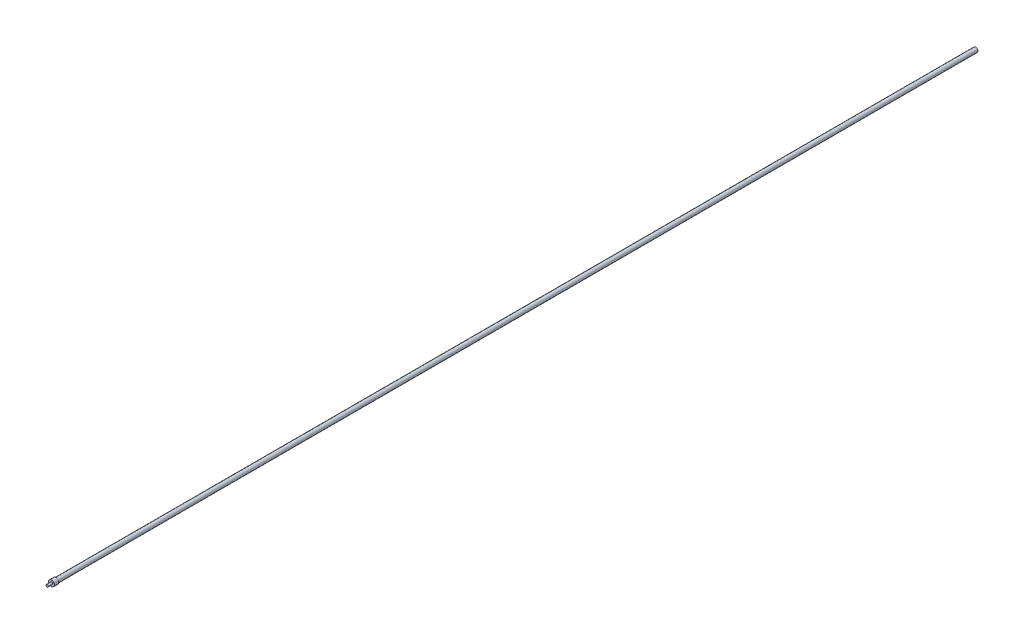
ISO-10303-21;
HEADER;
FILE_DESCRIPTION(('STEP AP214'),'2;1');
FILE_NAME('part.step','',(''),(''),'','','');
FILE_SCHEMA(('AUTOMOTIVE_DESIGN { 1 0 10303 214 1 1 1 1 }'));
ENDSEC;
DATA;
#1=APPLICATION_CONTEXT('core data for automotive mechanical design processes');
#2=APPLICATION_PROTOCOL_DEFINITION('international standard','automotive_design',2000,#1);
#3=PRODUCT_CONTEXT('',#1,'mechanical');
#4=PRODUCT('Part','Part','',(#3));
#5=PRODUCT_RELATED_PRODUCT_CATEGORY('part','',(#4));
#6=PRODUCT_DEFINITION_FORMATION('','',#4);
#7=PRODUCT_DEFINITION_CONTEXT('part definition',#1,'design');
#8=PRODUCT_DEFINITION('design','',#6,#7);
#9=PRODUCT_DEFINITION_SHAPE('','',#8);
#10=(LENGTH_UNIT() NAMED_UNIT(*) SI_UNIT(.MILLI.,.METRE.));
#11=(NAMED_UNIT(*) PLANE_ANGLE_UNIT() SI_UNIT($,.RADIAN.));
#12=(NAMED_UNIT(*) SI_UNIT($,.STERADIAN.) SOLID_ANGLE_UNIT());
#13=UNCERTAINTY_MEASURE_WITH_UNIT(LENGTH_MEASURE(1.E-05),#10,'distance_accuracy_value','');
#14=(GEOMETRIC_REPRESENTATION_CONTEXT(3) GLOBAL_UNCERTAINTY_ASSIGNED_CONTEXT((#13)) GLOBAL_UNIT_ASSIGNED_CONTEXT((#10,
#11,#12)) REPRESENTATION_CONTEXT('',''));
#15=CARTESIAN_POINT('',(0.,0.,0.));
#16=DIRECTION('',(0.,0.,1.));
#17=DIRECTION('',(1.,0.,0.));
#18=AXIS2_PLACEMENT_3D('',#15,#16,#17);
#19=CARTESIAN_POINT('',(0.,0.,2545.));
#20=DIRECTION('',(0.,0.,-1.));
#21=DIRECTION('',(-1.,0.,0.));
#22=AXIS2_PLACEMENT_3D('',#19,#20,#21);
#23=CYLINDRICAL_SURFACE('',#22,6.35);
#24=CARTESIAN_POINT('',(0.,0.,2545.));
#25=DIRECTION('',(0.,0.,1.));
#26=DIRECTION('',(1.,0.,0.));
#27=AXIS2_PLACEMENT_3D('',#24,#25,#26);
#28=CIRCLE('',#27,6.35);
#29=CARTESIAN_POINT('',(6.35,0.,2545.));
#30=VERTEX_POINT('',#29);
#31=EDGE_CURVE('E10',#30,#30,#28,.T.);
#32=ORIENTED_EDGE('',*,*,#31,.F.);
#33=EDGE_LOOP('',(#32));
#34=FACE_BOUND('',#33,.T.);
#35=CARTESIAN_POINT('',(0.,0.,0.));
#36=DIRECTION('',(0.,0.,1.));
#37=DIRECTION('',(1.,0.,0.));
#38=AXIS2_PLACEMENT_3D('',#35,#36,#37);
#39=CIRCLE('',#38,6.35);
#40=CARTESIAN_POINT('',(6.35,0.,0.));
#41=VERTEX_POINT('',#40);
#42=EDGE_CURVE('E36',#41,#41,#39,.T.);
#43=ORIENTED_EDGE('',*,*,#42,.T.);
#44=EDGE_LOOP('',(#43));
#45=FACE_BOUND('',#44,.T.);
#46=ADVANCED_FACE('F33',(#34,#45),#23,.T.);
#47=CARTESIAN_POINT('',(0.,0.,0.));
#48=DIRECTION('',(0.,0.,1.));
#49=DIRECTION('',(1.,0.,0.));
#50=AXIS2_PLACEMENT_3D('',#47,#48,#49);
#51=PLANE('',#50);
#52=ORIENTED_EDGE('',*,*,#42,.F.);
#53=EDGE_LOOP('',(#52));
#54=FACE_BOUND('',#53,.T.);
#55=ADVANCED_FACE('F75',(#54),#51,.F.);
#56=CARTESIAN_POINT('',(0.,0.,2557.));
#57=DIRECTION('',(0.,0.,-1.));
#58=DIRECTION('',(-1.,0.,0.));
#59=AXIS2_PLACEMENT_3D('',#56,#57,#58);
#60=CYLINDRICAL_SURFACE('',#59,8.);
#61=CARTESIAN_POINT('',(0.,0.,2557.));
#62=DIRECTION('',(0.,0.,1.));
#63=DIRECTION('',(1.,0.,0.));
#64=AXIS2_PLACEMENT_3D('',#61,#62,#63);
#65=CIRCLE('',#64,8.);
#66=CARTESIAN_POINT('',(8.,0.,2557.));
#67=VERTEX_POINT('',#66);
#68=EDGE_CURVE('E43',#67,#67,#65,.T.);
#69=ORIENTED_EDGE('',*,*,#68,.F.);
#70=EDGE_LOOP('',(#69));
#71=FACE_BOUND('',#70,.T.);
#72=CARTESIAN_POINT('',(0.,0.,2545.));
#73=DIRECTION('',(0.,0.,1.));
#74=DIRECTION('',(1.,0.,0.));
#75=AXIS2_PLACEMENT_3D('',#72,#73,#74);
#76=CIRCLE('',#75,8.);
#77=CARTESIAN_POINT('',(8.,0.,2545.));
#78=VERTEX_POINT('',#77);
#79=EDGE_CURVE('E45',#78,#78,#76,.T.);
#80=ORIENTED_EDGE('',*,*,#79,.T.);
#81=EDGE_LOOP('',(#80));
#82=FACE_BOUND('',#81,.T.);
#83=ADVANCED_FACE('F69',(#71,#82),#60,.T.);
#84=CARTESIAN_POINT('',(0.,0.,2557.));
#85=DIRECTION('',(0.,0.,1.));
#86=DIRECTION('',(1.,0.,0.));
#87=AXIS2_PLACEMENT_3D('',#84,#85,#86);
#88=PLANE('',#87);
#89=CARTESIAN_POINT('',(0.,0.,2557.));
#90=DIRECTION('',(0.,0.,1.));
#91=DIRECTION('',(1.,0.,0.));
#92=AXIS2_PLACEMENT_3D('',#89,#90,#91);
#93=CIRCLE('',#92,3.175);
#94=CARTESIAN_POINT('',(3.175,0.,2557.));
#95=VERTEX_POINT('',#94);
#96=EDGE_CURVE('E51',#95,#95,#93,.T.);
#97=ORIENTED_EDGE('',*,*,#96,.F.);
#98=EDGE_LOOP('',(#97));
#99=FACE_BOUND('',#98,.T.);
#100=ORIENTED_EDGE('',*,*,#68,.T.);
#101=EDGE_LOOP('',(#100));
#102=FACE_BOUND('',#101,.T.);
#103=ADVANCED_FACE('F66',(#99,#102),#88,.T.);
#104=CARTESIAN_POINT('',(0.,0.,2545.));
#105=DIRECTION('',(0.,0.,1.));
#106=DIRECTION('',(1.,0.,0.));
#107=AXIS2_PLACEMENT_3D('',#104,#105,#106);
#108=PLANE('',#107);
#109=ORIENTED_EDGE('',*,*,#31,.T.);
#110=EDGE_LOOP('',(#109));
#111=FACE_BOUND('',#110,.T.);
#112=ORIENTED_EDGE('',*,*,#79,.F.);
#113=EDGE_LOOP('',(#112));
#114=FACE_BOUND('',#113,.T.);
#115=ADVANCED_FACE('F62',(#111,#114),#108,.F.);
#116=CARTESIAN_POINT('',(0.,0.,2569.));
#117=DIRECTION('',(0.,0.,-1.));
#118=DIRECTION('',(-1.,0.,0.));
#119=AXIS2_PLACEMENT_3D('',#116,#117,#118);
#120=CYLINDRICAL_SURFACE('',#119,3.175);
#121=CARTESIAN_POINT('',(0.,0.,2569.));
#122=DIRECTION('',(0.,0.,1.));
#123=DIRECTION('',(1.,0.,0.));
#124=AXIS2_PLACEMENT_3D('',#121,#122,#123);
#125=CIRCLE('',#124,3.175);
#126=CARTESIAN_POINT('',(3.175,0.,2569.));
#127=VERTEX_POINT('',#126);
#128=EDGE_CURVE('E48',#127,#127,#125,.T.);
#129=ORIENTED_EDGE('',*,*,#128,.F.);
#130=EDGE_LOOP('',(#129));
#131=FACE_BOUND('',#130,.T.);
#132=ORIENTED_EDGE('',*,*,#96,.T.);
#133=EDGE_LOOP('',(#132));
#134=FACE_BOUND('',#133,.T.);
#135=ADVANCED_FACE('F59',(#131,#134),#120,.T.);
#136=CARTESIAN_POINT('',(0.,0.,2569.));
#137=DIRECTION('',(0.,0.,1.));
#138=DIRECTION('',(1.,0.,0.));
#139=AXIS2_PLACEMENT_3D('',#136,#137,#138);
#140=PLANE('',#139);
#141=ORIENTED_EDGE('',*,*,#128,.T.);
#142=EDGE_LOOP('',(#141));
#143=FACE_BOUND('',#142,.T.);
#144=ADVANCED_FACE('F57',(#143),#140,.T.);
#145=CLOSED_SHELL('',(#46,#55,#83,#103,#115,#135,#144));
#146=MANIFOLD_SOLID_BREP('B2',#145);
#147=ADVANCED_BREP_SHAPE_REPRESENTATION('',(#18,#146),#14);
#148=SHAPE_DEFINITION_REPRESENTATION(#9,#147);
ENDSEC;
END-ISO-10303-21;
